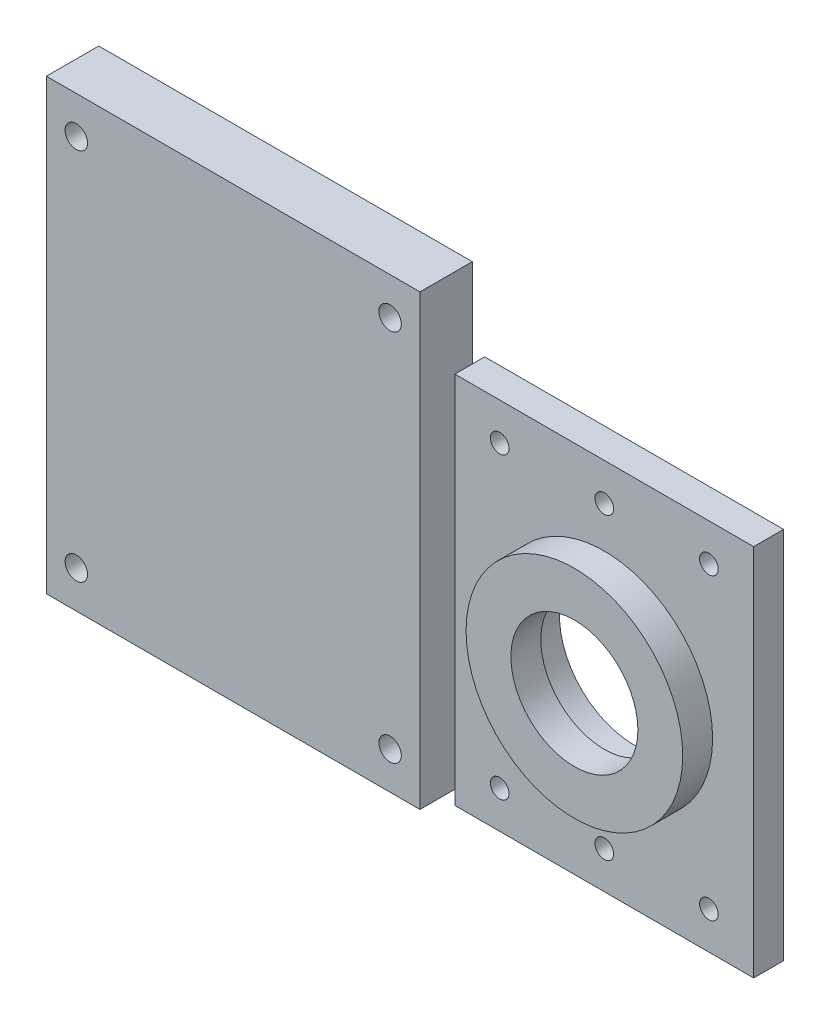
ISO-10303-21;
HEADER;
FILE_DESCRIPTION(('STEP AP214'),'2;1');
FILE_NAME('part.step','',(''),(''),'','','');
FILE_SCHEMA(('AUTOMOTIVE_DESIGN { 1 0 10303 214 1 1 1 1 }'));
ENDSEC;
DATA;
#1=APPLICATION_CONTEXT('core data for automotive mechanical design processes');
#2=APPLICATION_PROTOCOL_DEFINITION('international standard','automotive_design',2000,#1);
#3=PRODUCT_CONTEXT('',#1,'mechanical');
#4=PRODUCT('Part','Part','',(#3));
#5=PRODUCT_RELATED_PRODUCT_CATEGORY('part','',(#4));
#6=PRODUCT_DEFINITION_FORMATION('','',#4);
#7=PRODUCT_DEFINITION_CONTEXT('part definition',#1,'design');
#8=PRODUCT_DEFINITION('design','',#6,#7);
#9=PRODUCT_DEFINITION_SHAPE('','',#8);
#10=(LENGTH_UNIT() NAMED_UNIT(*) SI_UNIT(.MILLI.,.METRE.));
#11=(NAMED_UNIT(*) PLANE_ANGLE_UNIT() SI_UNIT($,.RADIAN.));
#12=(NAMED_UNIT(*) SI_UNIT($,.STERADIAN.) SOLID_ANGLE_UNIT());
#13=UNCERTAINTY_MEASURE_WITH_UNIT(LENGTH_MEASURE(1.E-05),#10,'distance_accuracy_value','');
#14=(GEOMETRIC_REPRESENTATION_CONTEXT(3) GLOBAL_UNCERTAINTY_ASSIGNED_CONTEXT((#13)) GLOBAL_UNIT_ASSIGNED_CONTEXT((#10,
#11,#12)) REPRESENTATION_CONTEXT('',''));
#15=CARTESIAN_POINT('',(0.,0.,0.));
#16=DIRECTION('',(0.,0.,1.));
#17=DIRECTION('',(1.,0.,0.));
#18=AXIS2_PLACEMENT_3D('',#15,#16,#17);
#19=CARTESIAN_POINT('',(-71.6694010067614,-24.8008935751944,7.));
#20=DIRECTION('',(-1.,0.,0.));
#21=DIRECTION('',(0.,-1.,0.));
#22=AXIS2_PLACEMENT_3D('',#19,#20,#21);
#23=PLANE('',#22);
#24=DIRECTION('',(0.,1.,0.));
#25=VECTOR('',#24,1.);
#26=CARTESIAN_POINT('',(-71.6694010067614,-24.8008935751944,0.));
#27=LINE('',#26,#25);
#28=CARTESIAN_POINT('',(-71.6694010067614,-24.8008935751944,0.));
#29=VERTEX_POINT('',#28);
#30=CARTESIAN_POINT('',(-71.6694010067614,35.1991064248056,0.));
#31=VERTEX_POINT('',#30);
#32=EDGE_CURVE('E128',#29,#31,#27,.T.);
#33=ORIENTED_EDGE('',*,*,#32,.F.);
#34=DIRECTION('',(0.,0.,-1.));
#35=VECTOR('',#34,1.);
#36=CARTESIAN_POINT('',(-71.6694010067614,-24.8008935751944,7.));
#37=LINE('',#36,#35);
#38=CARTESIAN_POINT('',(-71.6694010067614,-24.8008935751944,7.));
#39=VERTEX_POINT('',#38);
#40=EDGE_CURVE('E12',#39,#29,#37,.T.);
#41=ORIENTED_EDGE('',*,*,#40,.F.);
#42=DIRECTION('',(0.,1.,0.));
#43=VECTOR('',#42,1.);
#44=CARTESIAN_POINT('',(-71.6694010067614,-24.8008935751944,7.));
#45=LINE('',#44,#43);
#46=CARTESIAN_POINT('',(-71.6694010067614,35.1991064248056,7.));
#47=VERTEX_POINT('',#46);
#48=EDGE_CURVE('E119',#39,#47,#45,.T.);
#49=ORIENTED_EDGE('',*,*,#48,.T.);
#50=DIRECTION('',(0.,0.,-1.));
#51=VECTOR('',#50,1.);
#52=CARTESIAN_POINT('',(-71.6694010067614,35.1991064248056,7.));
#53=LINE('',#52,#51);
#54=EDGE_CURVE('E60',#47,#31,#53,.T.);
#55=ORIENTED_EDGE('',*,*,#54,.T.);
#56=EDGE_LOOP('',(#33,#41,#49,#55));
#57=FACE_BOUND('',#56,.T.);
#58=ADVANCED_FACE('F57',(#57),#23,.T.);
#59=CARTESIAN_POINT('',(-71.6694010067614,-24.8008935751944,7.));
#60=DIRECTION('',(0.,-1.,0.));
#61=DIRECTION('',(0.,0.,-1.));
#62=AXIS2_PLACEMENT_3D('',#59,#60,#61);
#63=PLANE('',#62);
#64=DIRECTION('',(-1.,0.,0.));
#65=VECTOR('',#64,1.);
#66=CARTESIAN_POINT('',(-71.6694010067614,-24.8008935751944,0.));
#67=LINE('',#66,#65);
#68=CARTESIAN_POINT('',(-21.6694010067614,-24.8008935751944,0.));
#69=VERTEX_POINT('',#68);
#70=EDGE_CURVE('E122',#69,#29,#67,.T.);
#71=ORIENTED_EDGE('',*,*,#70,.F.);
#72=DIRECTION('',(0.,0.,-1.));
#73=VECTOR('',#72,1.);
#74=CARTESIAN_POINT('',(-21.6694010067614,-24.8008935751944,7.));
#75=LINE('',#74,#73);
#76=CARTESIAN_POINT('',(-21.6694010067614,-24.8008935751944,7.));
#77=VERTEX_POINT('',#76);
#78=EDGE_CURVE('E67',#77,#69,#75,.T.);
#79=ORIENTED_EDGE('',*,*,#78,.F.);
#80=DIRECTION('',(-1.,0.,0.));
#81=VECTOR('',#80,1.);
#82=CARTESIAN_POINT('',(-71.6694010067614,-24.8008935751944,7.));
#83=LINE('',#82,#81);
#84=EDGE_CURVE('E114',#77,#39,#83,.T.);
#85=ORIENTED_EDGE('',*,*,#84,.T.);
#86=ORIENTED_EDGE('',*,*,#40,.T.);
#87=EDGE_LOOP('',(#71,#79,#85,#86));
#88=FACE_BOUND('',#87,.T.);
#89=ADVANCED_FACE('F145',(#88),#63,.T.);
#90=CARTESIAN_POINT('',(-21.6694010067614,-24.8008935751944,7.));
#91=DIRECTION('',(1.,0.,0.));
#92=DIRECTION('',(0.,0.,-1.));
#93=AXIS2_PLACEMENT_3D('',#90,#91,#92);
#94=PLANE('',#93);
#95=DIRECTION('',(0.,-1.,0.));
#96=VECTOR('',#95,1.);
#97=CARTESIAN_POINT('',(-21.6694010067614,-24.8008935751944,0.));
#98=LINE('',#97,#96);
#99=CARTESIAN_POINT('',(-21.6694010067614,35.1991064248056,0.));
#100=VERTEX_POINT('',#99);
#101=EDGE_CURVE('E108',#100,#69,#98,.T.);
#102=ORIENTED_EDGE('',*,*,#101,.F.);
#103=DIRECTION('',(0.,0.,-1.));
#104=VECTOR('',#103,1.);
#105=CARTESIAN_POINT('',(-21.6694010067614,35.1991064248056,7.));
#106=LINE('',#105,#104);
#107=CARTESIAN_POINT('',(-21.6694010067614,35.1991064248056,7.));
#108=VERTEX_POINT('',#107);
#109=EDGE_CURVE('E103',#108,#100,#106,.T.);
#110=ORIENTED_EDGE('',*,*,#109,.F.);
#111=DIRECTION('',(0.,-1.,0.));
#112=VECTOR('',#111,1.);
#113=CARTESIAN_POINT('',(-21.6694010067614,-24.8008935751944,7.));
#114=LINE('',#113,#112);
#115=EDGE_CURVE('E106',#108,#77,#114,.T.);
#116=ORIENTED_EDGE('',*,*,#115,.T.);
#117=ORIENTED_EDGE('',*,*,#78,.T.);
#118=EDGE_LOOP('',(#102,#110,#116,#117));
#119=FACE_BOUND('',#118,.T.);
#120=ADVANCED_FACE('F105',(#119),#94,.T.);
#121=CARTESIAN_POINT('',(-71.6694010067614,35.1991064248056,7.));
#122=DIRECTION('',(0.,1.,0.));
#123=DIRECTION('',(0.,0.,1.));
#124=AXIS2_PLACEMENT_3D('',#121,#122,#123);
#125=PLANE('',#124);
#126=DIRECTION('',(1.,0.,0.));
#127=VECTOR('',#126,1.);
#128=CARTESIAN_POINT('',(-71.6694010067614,35.1991064248056,0.));
#129=LINE('',#128,#127);
#130=EDGE_CURVE('E132',#31,#100,#129,.T.);
#131=ORIENTED_EDGE('',*,*,#130,.F.);
#132=ORIENTED_EDGE('',*,*,#54,.F.);
#133=DIRECTION('',(1.,0.,0.));
#134=VECTOR('',#133,1.);
#135=CARTESIAN_POINT('',(-71.6694010067614,35.1991064248056,7.));
#136=LINE('',#135,#134);
#137=EDGE_CURVE('E113',#47,#108,#136,.T.);
#138=ORIENTED_EDGE('',*,*,#137,.T.);
#139=ORIENTED_EDGE('',*,*,#109,.T.);
#140=EDGE_LOOP('',(#131,#132,#138,#139));
#141=FACE_BOUND('',#140,.T.);
#142=ADVANCED_FACE('F117',(#141),#125,.T.);
#143=CARTESIAN_POINT('',(0.,0.,7.));
#144=DIRECTION('',(0.,0.,-1.));
#145=DIRECTION('',(-1.,0.,0.));
#146=AXIS2_PLACEMENT_3D('',#143,#144,#145);
#147=PLANE('',#146);
#148=CARTESIAN_POINT('',(-67.6694010067614,30.1991064248056,7.));
#149=DIRECTION('',(0.,0.,-1.));
#150=DIRECTION('',(1.,0.,0.));
#151=AXIS2_PLACEMENT_3D('',#148,#149,#150);
#152=CIRCLE('',#151,1.5);
#153=CARTESIAN_POINT('',(-66.1694010067614,30.1991064248056,7.));
#154=VERTEX_POINT('',#153);
#155=EDGE_CURVE('E186',#154,#154,#152,.T.);
#156=ORIENTED_EDGE('',*,*,#155,.T.);
#157=EDGE_LOOP('',(#156));
#158=FACE_BOUND('',#157,.T.);
#159=CARTESIAN_POINT('',(-25.6694010067614,30.1991064248056,7.));
#160=DIRECTION('',(0.,0.,-1.));
#161=DIRECTION('',(-1.,0.,0.));
#162=AXIS2_PLACEMENT_3D('',#159,#160,#161);
#163=CIRCLE('',#162,1.5);
#164=CARTESIAN_POINT('',(-27.1694010067614,30.1991064248056,7.));
#165=VERTEX_POINT('',#164);
#166=EDGE_CURVE('E196',#165,#165,#163,.T.);
#167=ORIENTED_EDGE('',*,*,#166,.T.);
#168=EDGE_LOOP('',(#167));
#169=FACE_BOUND('',#168,.T.);
#170=CARTESIAN_POINT('',(-25.6694010067614,-19.8008935751944,7.));
#171=DIRECTION('',(0.,0.,-1.));
#172=DIRECTION('',(1.,0.,0.));
#173=AXIS2_PLACEMENT_3D('',#170,#171,#172);
#174=CIRCLE('',#173,1.5);
#175=CARTESIAN_POINT('',(-24.1694010067614,-19.8008935751944,7.));
#176=VERTEX_POINT('',#175);
#177=EDGE_CURVE('E204',#176,#176,#174,.T.);
#178=ORIENTED_EDGE('',*,*,#177,.T.);
#179=EDGE_LOOP('',(#178));
#180=FACE_BOUND('',#179,.T.);
#181=CARTESIAN_POINT('',(-67.6694010067614,-19.8008935751944,7.));
#182=DIRECTION('',(0.,0.,-1.));
#183=DIRECTION('',(-1.,0.,0.));
#184=AXIS2_PLACEMENT_3D('',#181,#182,#183);
#185=CIRCLE('',#184,1.5);
#186=CARTESIAN_POINT('',(-69.1694010067614,-19.8008935751944,7.));
#187=VERTEX_POINT('',#186);
#188=EDGE_CURVE('E133',#187,#187,#185,.T.);
#189=ORIENTED_EDGE('',*,*,#188,.T.);
#190=EDGE_LOOP('',(#189));
#191=FACE_BOUND('',#190,.T.);
#192=ORIENTED_EDGE('',*,*,#48,.F.);
#193=ORIENTED_EDGE('',*,*,#84,.F.);
#194=ORIENTED_EDGE('',*,*,#115,.F.);
#195=ORIENTED_EDGE('',*,*,#137,.F.);
#196=EDGE_LOOP('',(#192,#193,#194,#195));
#197=FACE_BOUND('',#196,.T.);
#198=ADVANCED_FACE('F112',(#158,#169,#180,#191,#197),#147,.F.);
#199=CARTESIAN_POINT('',(0.,0.,0.));
#200=DIRECTION('',(0.,0.,-1.));
#201=DIRECTION('',(-1.,0.,0.));
#202=AXIS2_PLACEMENT_3D('',#199,#200,#201);
#203=PLANE('',#202);
#204=CARTESIAN_POINT('',(-67.6694010067614,30.1991064248056,0.));
#205=DIRECTION('',(0.,0.,-1.));
#206=DIRECTION('',(1.,0.,0.));
#207=AXIS2_PLACEMENT_3D('',#204,#205,#206);
#208=CIRCLE('',#207,1.5);
#209=CARTESIAN_POINT('',(-66.1694010067614,30.1991064248056,0.));
#210=VERTEX_POINT('',#209);
#211=EDGE_CURVE('E189',#210,#210,#208,.T.);
#212=ORIENTED_EDGE('',*,*,#211,.F.);
#213=EDGE_LOOP('',(#212));
#214=FACE_BOUND('',#213,.T.);
#215=CARTESIAN_POINT('',(-25.6694010067614,30.1991064248056,0.));
#216=DIRECTION('',(0.,0.,-1.));
#217=DIRECTION('',(-1.,0.,0.));
#218=AXIS2_PLACEMENT_3D('',#215,#216,#217);
#219=CIRCLE('',#218,1.5);
#220=CARTESIAN_POINT('',(-27.1694010067614,30.1991064248056,0.));
#221=VERTEX_POINT('',#220);
#222=EDGE_CURVE('E193',#221,#221,#219,.T.);
#223=ORIENTED_EDGE('',*,*,#222,.F.);
#224=EDGE_LOOP('',(#223));
#225=FACE_BOUND('',#224,.T.);
#226=CARTESIAN_POINT('',(-25.6694010067614,-19.8008935751944,0.));
#227=DIRECTION('',(0.,0.,-1.));
#228=DIRECTION('',(1.,0.,0.));
#229=AXIS2_PLACEMENT_3D('',#226,#227,#228);
#230=CIRCLE('',#229,1.5);
#231=CARTESIAN_POINT('',(-24.1694010067614,-19.8008935751944,0.));
#232=VERTEX_POINT('',#231);
#233=EDGE_CURVE('E200',#232,#232,#230,.T.);
#234=ORIENTED_EDGE('',*,*,#233,.F.);
#235=EDGE_LOOP('',(#234));
#236=FACE_BOUND('',#235,.T.);
#237=CARTESIAN_POINT('',(-67.6694010067614,-19.8008935751944,0.));
#238=DIRECTION('',(0.,0.,-1.));
#239=DIRECTION('',(-1.,0.,0.));
#240=AXIS2_PLACEMENT_3D('',#237,#238,#239);
#241=CIRCLE('',#240,1.5);
#242=CARTESIAN_POINT('',(-69.1694010067614,-19.8008935751944,0.));
#243=VERTEX_POINT('',#242);
#244=EDGE_CURVE('E208',#243,#243,#241,.T.);
#245=ORIENTED_EDGE('',*,*,#244,.F.);
#246=EDGE_LOOP('',(#245));
#247=FACE_BOUND('',#246,.T.);
#248=ORIENTED_EDGE('',*,*,#32,.T.);
#249=ORIENTED_EDGE('',*,*,#130,.T.);
#250=ORIENTED_EDGE('',*,*,#101,.T.);
#251=ORIENTED_EDGE('',*,*,#70,.T.);
#252=EDGE_LOOP('',(#248,#249,#250,#251));
#253=FACE_BOUND('',#252,.T.);
#254=ADVANCED_FACE('F144',(#214,#225,#236,#247,#253),#203,.T.);
#255=CARTESIAN_POINT('',(-67.6694010067614,-19.8008935751944,7.));
#256=DIRECTION('',(0.,0.,-1.));
#257=DIRECTION('',(-1.,0.,0.));
#258=AXIS2_PLACEMENT_3D('',#255,#256,#257);
#259=CYLINDRICAL_SURFACE('',#258,1.5);
#260=ORIENTED_EDGE('',*,*,#188,.F.);
#261=EDGE_LOOP('',(#260));
#262=FACE_BOUND('',#261,.T.);
#263=ORIENTED_EDGE('',*,*,#244,.T.);
#264=EDGE_LOOP('',(#263));
#265=FACE_BOUND('',#264,.T.);
#266=ADVANCED_FACE('F163',(#262,#265),#259,.F.);
#267=CARTESIAN_POINT('',(-25.6694010067614,-19.8008935751944,7.));
#268=DIRECTION('',(0.,0.,-1.));
#269=DIRECTION('',(-1.,0.,0.));
#270=AXIS2_PLACEMENT_3D('',#267,#268,#269);
#271=CYLINDRICAL_SURFACE('',#270,1.5);
#272=ORIENTED_EDGE('',*,*,#177,.F.);
#273=EDGE_LOOP('',(#272));
#274=FACE_BOUND('',#273,.T.);
#275=ORIENTED_EDGE('',*,*,#233,.T.);
#276=EDGE_LOOP('',(#275));
#277=FACE_BOUND('',#276,.T.);
#278=ADVANCED_FACE('F170',(#274,#277),#271,.F.);
#279=CARTESIAN_POINT('',(-25.6694010067614,30.1991064248056,7.));
#280=DIRECTION('',(0.,0.,-1.));
#281=DIRECTION('',(-1.,0.,0.));
#282=AXIS2_PLACEMENT_3D('',#279,#280,#281);
#283=CYLINDRICAL_SURFACE('',#282,1.5);
#284=ORIENTED_EDGE('',*,*,#166,.F.);
#285=EDGE_LOOP('',(#284));
#286=FACE_BOUND('',#285,.T.);
#287=ORIENTED_EDGE('',*,*,#222,.T.);
#288=EDGE_LOOP('',(#287));
#289=FACE_BOUND('',#288,.T.);
#290=ADVANCED_FACE('F174',(#286,#289),#283,.F.);
#291=CARTESIAN_POINT('',(-67.6694010067614,30.1991064248056,7.));
#292=DIRECTION('',(0.,0.,-1.));
#293=DIRECTION('',(-1.,0.,0.));
#294=AXIS2_PLACEMENT_3D('',#291,#292,#293);
#295=CYLINDRICAL_SURFACE('',#294,1.5);
#296=ORIENTED_EDGE('',*,*,#155,.F.);
#297=EDGE_LOOP('',(#296));
#298=FACE_BOUND('',#297,.T.);
#299=ORIENTED_EDGE('',*,*,#211,.T.);
#300=EDGE_LOOP('',(#299));
#301=FACE_BOUND('',#300,.T.);
#302=ADVANCED_FACE('F178',(#298,#301),#295,.F.);
#303=CLOSED_SHELL('',(#58,#89,#120,#142,#198,#254,#266,#278,#290,#302));
#304=MANIFOLD_SOLID_BREP('B2_NOT_SHOWN',#303);
#305=CARTESIAN_POINT('',(0.,0.,4.));
#306=DIRECTION('',(0.,0.,1.));
#307=DIRECTION('',(1.,0.,0.));
#308=AXIS2_PLACEMENT_3D('',#305,#306,#307);
#309=PLANE('',#308);
#310=CARTESIAN_POINT('',(0.,0.,4.));
#311=DIRECTION('',(0.,0.,1.));
#312=DIRECTION('',(1.,0.,0.));
#313=AXIS2_PLACEMENT_3D('',#310,#311,#312);
#314=CIRCLE('',#313,14.5);
#315=CARTESIAN_POINT('',(14.5,0.,4.));
#316=VERTEX_POINT('',#315);
#317=EDGE_CURVE('E406',#316,#316,#314,.T.);
#318=ORIENTED_EDGE('',*,*,#317,.F.);
#319=EDGE_LOOP('',(#318));
#320=FACE_BOUND('',#319,.T.);
#321=CARTESIAN_POINT('',(0.,-20.,4.));
#322=DIRECTION('',(0.,0.,1.));
#323=DIRECTION('',(1.,0.,0.));
#324=AXIS2_PLACEMENT_3D('',#321,#322,#323);
#325=CIRCLE('',#324,1.25);
#326=CARTESIAN_POINT('',(1.25,-20.,4.));
#327=VERTEX_POINT('',#326);
#328=EDGE_CURVE('E388',#327,#327,#325,.T.);
#329=ORIENTED_EDGE('',*,*,#328,.F.);
#330=EDGE_LOOP('',(#329));
#331=FACE_BOUND('',#330,.T.);
#332=CARTESIAN_POINT('',(-14.,20.,4.));
#333=DIRECTION('',(0.,0.,1.));
#334=DIRECTION('',(1.,0.,0.));
#335=AXIS2_PLACEMENT_3D('',#332,#333,#334);
#336=CIRCLE('',#335,1.25);
#337=CARTESIAN_POINT('',(-12.75,20.,4.));
#338=VERTEX_POINT('',#337);
#339=EDGE_CURVE('E376',#338,#338,#336,.T.);
#340=ORIENTED_EDGE('',*,*,#339,.F.);
#341=EDGE_LOOP('',(#340));
#342=FACE_BOUND('',#341,.T.);
#343=CARTESIAN_POINT('',(-14.,-20.,4.));
#344=DIRECTION('',(0.,0.,1.));
#345=DIRECTION('',(1.,0.,0.));
#346=AXIS2_PLACEMENT_3D('',#343,#344,#345);
#347=CIRCLE('',#346,1.25);
#348=CARTESIAN_POINT('',(-12.75,-20.,4.));
#349=VERTEX_POINT('',#348);
#350=EDGE_CURVE('E366',#349,#349,#347,.T.);
#351=ORIENTED_EDGE('',*,*,#350,.F.);
#352=EDGE_LOOP('',(#351));
#353=FACE_BOUND('',#352,.T.);
#354=DIRECTION('',(1.,0.,0.));
#355=VECTOR('',#354,1.);
#356=CARTESIAN_POINT('',(-20.,-25.,4.));
#357=LINE('',#356,#355);
#358=CARTESIAN_POINT('',(-20.,-25.,4.));
#359=VERTEX_POINT('',#358);
#360=CARTESIAN_POINT('',(20.,-25.,4.));
#361=VERTEX_POINT('',#360);
#362=EDGE_CURVE('E337',#359,#361,#357,.T.);
#363=ORIENTED_EDGE('',*,*,#362,.T.);
#364=DIRECTION('',(0.,1.,0.));
#365=VECTOR('',#364,1.);
#366=CARTESIAN_POINT('',(20.,-25.,4.));
#367=LINE('',#366,#365);
#368=CARTESIAN_POINT('',(20.,25.,4.));
#369=VERTEX_POINT('',#368);
#370=EDGE_CURVE('E332',#361,#369,#367,.T.);
#371=ORIENTED_EDGE('',*,*,#370,.T.);
#372=DIRECTION('',(-1.,0.,0.));
#373=VECTOR('',#372,1.);
#374=CARTESIAN_POINT('',(-20.,25.,4.));
#375=LINE('',#374,#373);
#376=CARTESIAN_POINT('',(-20.,25.,4.));
#377=VERTEX_POINT('',#376);
#378=EDGE_CURVE('E335',#369,#377,#375,.T.);
#379=ORIENTED_EDGE('',*,*,#378,.T.);
#380=DIRECTION('',(0.,-1.,0.));
#381=VECTOR('',#380,1.);
#382=CARTESIAN_POINT('',(-20.,-25.,4.));
#383=LINE('',#382,#381);
#384=EDGE_CURVE('E302',#377,#359,#383,.T.);
#385=ORIENTED_EDGE('',*,*,#384,.T.);
#386=EDGE_LOOP('',(#363,#371,#379,#385));
#387=FACE_BOUND('',#386,.T.);
#388=CARTESIAN_POINT('',(14.,-20.,4.));
#389=DIRECTION('',(0.,0.,1.));
#390=DIRECTION('',(1.,0.,0.));
#391=AXIS2_PLACEMENT_3D('',#388,#389,#390);
#392=CIRCLE('',#391,1.25);
#393=CARTESIAN_POINT('',(15.25,-20.,4.));
#394=VERTEX_POINT('',#393);
#395=EDGE_CURVE('E370',#394,#394,#392,.T.);
#396=ORIENTED_EDGE('',*,*,#395,.F.);
#397=EDGE_LOOP('',(#396));
#398=FACE_BOUND('',#397,.T.);
#399=CARTESIAN_POINT('',(14.,20.,4.));
#400=DIRECTION('',(0.,0.,1.));
#401=DIRECTION('',(1.,0.,0.));
#402=AXIS2_PLACEMENT_3D('',#399,#400,#401);
#403=CIRCLE('',#402,1.25);
#404=CARTESIAN_POINT('',(15.25,20.,4.));
#405=VERTEX_POINT('',#404);
#406=EDGE_CURVE('E382',#405,#405,#403,.T.);
#407=ORIENTED_EDGE('',*,*,#406,.F.);
#408=EDGE_LOOP('',(#407));
#409=FACE_BOUND('',#408,.T.);
#410=CARTESIAN_POINT('',(0.,20.,4.));
#411=DIRECTION('',(0.,0.,1.));
#412=DIRECTION('',(1.,0.,0.));
#413=AXIS2_PLACEMENT_3D('',#410,#411,#412);
#414=CIRCLE('',#413,1.25);
#415=CARTESIAN_POINT('',(1.25,20.,4.));
#416=VERTEX_POINT('',#415);
#417=EDGE_CURVE('E394',#416,#416,#414,.T.);
#418=ORIENTED_EDGE('',*,*,#417,.F.);
#419=EDGE_LOOP('',(#418));
#420=FACE_BOUND('',#419,.T.);
#421=ADVANCED_FACE('F285',(#320,#331,#342,#353,#387,#398,#409,#420),#309,.T.);
#422=CARTESIAN_POINT('',(0.,0.,0.));
#423=DIRECTION('',(0.,0.,1.));
#424=DIRECTION('',(1.,0.,0.));
#425=AXIS2_PLACEMENT_3D('',#422,#423,#424);
#426=PLANE('',#425);
#427=DIRECTION('',(1.,0.,0.));
#428=VECTOR('',#427,1.);
#429=CARTESIAN_POINT('',(-20.,-25.,0.));
#430=LINE('',#429,#428);
#431=CARTESIAN_POINT('',(-20.,-25.,0.));
#432=VERTEX_POINT('',#431);
#433=CARTESIAN_POINT('',(20.,-25.,0.));
#434=VERTEX_POINT('',#433);
#435=EDGE_CURVE('E349',#432,#434,#430,.T.);
#436=ORIENTED_EDGE('',*,*,#435,.F.);
#437=DIRECTION('',(0.,-1.,0.));
#438=VECTOR('',#437,1.);
#439=CARTESIAN_POINT('',(-20.,-25.,0.));
#440=LINE('',#439,#438);
#441=CARTESIAN_POINT('',(-20.,25.,0.));
#442=VERTEX_POINT('',#441);
#443=EDGE_CURVE('E325',#442,#432,#440,.T.);
#444=ORIENTED_EDGE('',*,*,#443,.F.);
#445=DIRECTION('',(-1.,0.,0.));
#446=VECTOR('',#445,1.);
#447=CARTESIAN_POINT('',(-20.,25.,0.));
#448=LINE('',#447,#446);
#449=CARTESIAN_POINT('',(20.,25.,0.));
#450=VERTEX_POINT('',#449);
#451=EDGE_CURVE('E319',#450,#442,#448,.T.);
#452=ORIENTED_EDGE('',*,*,#451,.F.);
#453=DIRECTION('',(0.,1.,0.));
#454=VECTOR('',#453,1.);
#455=CARTESIAN_POINT('',(20.,-25.,0.));
#456=LINE('',#455,#454);
#457=EDGE_CURVE('E341',#434,#450,#456,.T.);
#458=ORIENTED_EDGE('',*,*,#457,.F.);
#459=EDGE_LOOP('',(#436,#444,#452,#458));
#460=FACE_BOUND('',#459,.T.);
#461=CARTESIAN_POINT('',(0.,0.,0.));
#462=DIRECTION('',(0.,0.,1.));
#463=DIRECTION('',(1.,0.,0.));
#464=AXIS2_PLACEMENT_3D('',#461,#462,#463);
#465=CIRCLE('',#464,10.);
#466=CARTESIAN_POINT('',(10.,0.,0.));
#467=VERTEX_POINT('',#466);
#468=EDGE_CURVE('E352',#467,#467,#465,.T.);
#469=ORIENTED_EDGE('',*,*,#468,.T.);
#470=EDGE_LOOP('',(#469));
#471=FACE_BOUND('',#470,.T.);
#472=CARTESIAN_POINT('',(-14.,-20.,0.));
#473=DIRECTION('',(0.,0.,1.));
#474=DIRECTION('',(1.,0.,0.));
#475=AXIS2_PLACEMENT_3D('',#472,#473,#474);
#476=CIRCLE('',#475,1.25);
#477=CARTESIAN_POINT('',(-12.75,-20.,0.));
#478=VERTEX_POINT('',#477);
#479=EDGE_CURVE('E367',#478,#478,#476,.T.);
#480=ORIENTED_EDGE('',*,*,#479,.T.);
#481=EDGE_LOOP('',(#480));
#482=FACE_BOUND('',#481,.T.);
#483=CARTESIAN_POINT('',(14.,-20.,0.));
#484=DIRECTION('',(0.,0.,1.));
#485=DIRECTION('',(1.,0.,0.));
#486=AXIS2_PLACEMENT_3D('',#483,#484,#485);
#487=CIRCLE('',#486,1.25);
#488=CARTESIAN_POINT('',(15.25,-20.,0.));
#489=VERTEX_POINT('',#488);
#490=EDGE_CURVE('E373',#489,#489,#487,.T.);
#491=ORIENTED_EDGE('',*,*,#490,.T.);
#492=EDGE_LOOP('',(#491));
#493=FACE_BOUND('',#492,.T.);
#494=CARTESIAN_POINT('',(-14.,20.,0.));
#495=DIRECTION('',(0.,0.,1.));
#496=DIRECTION('',(1.,0.,0.));
#497=AXIS2_PLACEMENT_3D('',#494,#495,#496);
#498=CIRCLE('',#497,1.25);
#499=CARTESIAN_POINT('',(-12.75,20.,0.));
#500=VERTEX_POINT('',#499);
#501=EDGE_CURVE('E379',#500,#500,#498,.T.);
#502=ORIENTED_EDGE('',*,*,#501,.T.);
#503=EDGE_LOOP('',(#502));
#504=FACE_BOUND('',#503,.T.);
#505=CARTESIAN_POINT('',(14.,20.,0.));
#506=DIRECTION('',(0.,0.,1.));
#507=DIRECTION('',(1.,0.,0.));
#508=AXIS2_PLACEMENT_3D('',#505,#506,#507);
#509=CIRCLE('',#508,1.25);
#510=CARTESIAN_POINT('',(15.25,20.,0.));
#511=VERTEX_POINT('',#510);
#512=EDGE_CURVE('E385',#511,#511,#509,.T.);
#513=ORIENTED_EDGE('',*,*,#512,.T.);
#514=EDGE_LOOP('',(#513));
#515=FACE_BOUND('',#514,.T.);
#516=CARTESIAN_POINT('',(0.,-20.,0.));
#517=DIRECTION('',(0.,0.,1.));
#518=DIRECTION('',(1.,0.,0.));
#519=AXIS2_PLACEMENT_3D('',#516,#517,#518);
#520=CIRCLE('',#519,1.25);
#521=CARTESIAN_POINT('',(1.25,-20.,0.));
#522=VERTEX_POINT('',#521);
#523=EDGE_CURVE('E391',#522,#522,#520,.T.);
#524=ORIENTED_EDGE('',*,*,#523,.T.);
#525=EDGE_LOOP('',(#524));
#526=FACE_BOUND('',#525,.T.);
#527=CARTESIAN_POINT('',(0.,20.,0.));
#528=DIRECTION('',(0.,0.,1.));
#529=DIRECTION('',(1.,0.,0.));
#530=AXIS2_PLACEMENT_3D('',#527,#528,#529);
#531=CIRCLE('',#530,1.25);
#532=CARTESIAN_POINT('',(1.25,20.,0.));
#533=VERTEX_POINT('',#532);
#534=EDGE_CURVE('E397',#533,#533,#531,.T.);
#535=ORIENTED_EDGE('',*,*,#534,.T.);
#536=EDGE_LOOP('',(#535));
#537=FACE_BOUND('',#536,.T.);
#538=ADVANCED_FACE('F360',(#460,#471,#482,#493,#504,#515,#526,#537),#426,.F.);
#539=CARTESIAN_POINT('',(-20.,-25.,4.));
#540=DIRECTION('',(0.,1.,0.));
#541=DIRECTION('',(-1.,0.,0.));
#542=AXIS2_PLACEMENT_3D('',#539,#540,#541);
#543=PLANE('',#542);
#544=ORIENTED_EDGE('',*,*,#435,.T.);
#545=DIRECTION('',(0.,0.,-1.));
#546=VECTOR('',#545,1.);
#547=CARTESIAN_POINT('',(20.,-25.,4.));
#548=LINE('',#547,#546);
#549=EDGE_CURVE('E55',#361,#434,#548,.T.);
#550=ORIENTED_EDGE('',*,*,#549,.F.);
#551=ORIENTED_EDGE('',*,*,#362,.F.);
#552=DIRECTION('',(0.,0.,-1.));
#553=VECTOR('',#552,1.);
#554=CARTESIAN_POINT('',(-20.,-25.,4.));
#555=LINE('',#554,#553);
#556=EDGE_CURVE('E345',#359,#432,#555,.T.);
#557=ORIENTED_EDGE('',*,*,#556,.T.);
#558=EDGE_LOOP('',(#544,#550,#551,#557));
#559=FACE_BOUND('',#558,.T.);
#560=ADVANCED_FACE('F287',(#559),#543,.F.);
#561=CARTESIAN_POINT('',(20.,-25.,4.));
#562=DIRECTION('',(-1.,0.,0.));
#563=DIRECTION('',(0.,0.,1.));
#564=AXIS2_PLACEMENT_3D('',#561,#562,#563);
#565=PLANE('',#564);
#566=ORIENTED_EDGE('',*,*,#457,.T.);
#567=DIRECTION('',(0.,0.,-1.));
#568=VECTOR('',#567,1.);
#569=CARTESIAN_POINT('',(20.,25.,4.));
#570=LINE('',#569,#568);
#571=EDGE_CURVE('E294',#369,#450,#570,.T.);
#572=ORIENTED_EDGE('',*,*,#571,.F.);
#573=ORIENTED_EDGE('',*,*,#370,.F.);
#574=ORIENTED_EDGE('',*,*,#549,.T.);
#575=EDGE_LOOP('',(#566,#572,#573,#574));
#576=FACE_BOUND('',#575,.T.);
#577=ADVANCED_FACE('F340',(#576),#565,.F.);
#578=CARTESIAN_POINT('',(-20.,25.,4.));
#579=DIRECTION('',(0.,-1.,0.));
#580=DIRECTION('',(1.,0.,0.));
#581=AXIS2_PLACEMENT_3D('',#578,#579,#580);
#582=PLANE('',#581);
#583=ORIENTED_EDGE('',*,*,#451,.T.);
#584=DIRECTION('',(0.,0.,-1.));
#585=VECTOR('',#584,1.);
#586=CARTESIAN_POINT('',(-20.,25.,4.));
#587=LINE('',#586,#585);
#588=EDGE_CURVE('E342',#377,#442,#587,.T.);
#589=ORIENTED_EDGE('',*,*,#588,.F.);
#590=ORIENTED_EDGE('',*,*,#378,.F.);
#591=ORIENTED_EDGE('',*,*,#571,.T.);
#592=EDGE_LOOP('',(#583,#589,#590,#591));
#593=FACE_BOUND('',#592,.T.);
#594=ADVANCED_FACE('F343',(#593),#582,.F.);
#595=CARTESIAN_POINT('',(-20.,-25.,4.));
#596=DIRECTION('',(1.,0.,0.));
#597=DIRECTION('',(0.,0.,-1.));
#598=AXIS2_PLACEMENT_3D('',#595,#596,#597);
#599=PLANE('',#598);
#600=ORIENTED_EDGE('',*,*,#443,.T.);
#601=ORIENTED_EDGE('',*,*,#556,.F.);
#602=ORIENTED_EDGE('',*,*,#384,.F.);
#603=ORIENTED_EDGE('',*,*,#588,.T.);
#604=EDGE_LOOP('',(#600,#601,#602,#603));
#605=FACE_BOUND('',#604,.T.);
#606=ADVANCED_FACE('F357',(#605),#599,.F.);
#607=CARTESIAN_POINT('',(0.,0.,4.));
#608=DIRECTION('',(0.,0.,-1.));
#609=DIRECTION('',(-1.,0.,0.));
#610=AXIS2_PLACEMENT_3D('',#607,#608,#609);
#611=CYLINDRICAL_SURFACE('',#610,10.);
#612=CARTESIAN_POINT('',(0.,0.,4.));
#613=DIRECTION('',(0.,0.,1.));
#614=DIRECTION('',(1.,0.,0.));
#615=AXIS2_PLACEMENT_3D('',#612,#613,#614);
#616=CIRCLE('',#615,10.);
#617=CARTESIAN_POINT('',(10.,0.,4.));
#618=VERTEX_POINT('',#617);
#619=EDGE_CURVE('E400',#618,#618,#616,.T.);
#620=ORIENTED_EDGE('',*,*,#619,.T.);
#621=EDGE_LOOP('',(#620));
#622=FACE_BOUND('',#621,.T.);
#623=ORIENTED_EDGE('',*,*,#468,.F.);
#624=EDGE_LOOP('',(#623));
#625=FACE_BOUND('',#624,.T.);
#626=ADVANCED_FACE('F448',(#622,#625),#611,.F.);
#627=CARTESIAN_POINT('',(-14.,-20.,4.));
#628=DIRECTION('',(0.,0.,-1.));
#629=DIRECTION('',(-1.,0.,0.));
#630=AXIS2_PLACEMENT_3D('',#627,#628,#629);
#631=CYLINDRICAL_SURFACE('',#630,1.25);
#632=ORIENTED_EDGE('',*,*,#350,.T.);
#633=EDGE_LOOP('',(#632));
#634=FACE_BOUND('',#633,.T.);
#635=ORIENTED_EDGE('',*,*,#479,.F.);
#636=EDGE_LOOP('',(#635));
#637=FACE_BOUND('',#636,.T.);
#638=ADVANCED_FACE('F493',(#634,#637),#631,.F.);
#639=CARTESIAN_POINT('',(14.,-20.,4.));
#640=DIRECTION('',(0.,0.,-1.));
#641=DIRECTION('',(-1.,0.,0.));
#642=AXIS2_PLACEMENT_3D('',#639,#640,#641);
#643=CYLINDRICAL_SURFACE('',#642,1.25);
#644=ORIENTED_EDGE('',*,*,#395,.T.);
#645=EDGE_LOOP('',(#644));
#646=FACE_BOUND('',#645,.T.);
#647=ORIENTED_EDGE('',*,*,#490,.F.);
#648=EDGE_LOOP('',(#647));
#649=FACE_BOUND('',#648,.T.);
#650=ADVANCED_FACE('F501',(#646,#649),#643,.F.);
#651=CARTESIAN_POINT('',(-14.,20.,4.));
#652=DIRECTION('',(0.,0.,-1.));
#653=DIRECTION('',(-1.,0.,0.));
#654=AXIS2_PLACEMENT_3D('',#651,#652,#653);
#655=CYLINDRICAL_SURFACE('',#654,1.25);
#656=ORIENTED_EDGE('',*,*,#339,.T.);
#657=EDGE_LOOP('',(#656));
#658=FACE_BOUND('',#657,.T.);
#659=ORIENTED_EDGE('',*,*,#501,.F.);
#660=EDGE_LOOP('',(#659));
#661=FACE_BOUND('',#660,.T.);
#662=ADVANCED_FACE('F509',(#658,#661),#655,.F.);
#663=CARTESIAN_POINT('',(14.,20.,4.));
#664=DIRECTION('',(0.,0.,-1.));
#665=DIRECTION('',(-1.,0.,0.));
#666=AXIS2_PLACEMENT_3D('',#663,#664,#665);
#667=CYLINDRICAL_SURFACE('',#666,1.25);
#668=ORIENTED_EDGE('',*,*,#406,.T.);
#669=EDGE_LOOP('',(#668));
#670=FACE_BOUND('',#669,.T.);
#671=ORIENTED_EDGE('',*,*,#512,.F.);
#672=EDGE_LOOP('',(#671));
#673=FACE_BOUND('',#672,.T.);
#674=ADVANCED_FACE('F518',(#670,#673),#667,.F.);
#675=CARTESIAN_POINT('',(0.,-20.,4.));
#676=DIRECTION('',(0.,0.,-1.));
#677=DIRECTION('',(-1.,0.,0.));
#678=AXIS2_PLACEMENT_3D('',#675,#676,#677);
#679=CYLINDRICAL_SURFACE('',#678,1.25);
#680=ORIENTED_EDGE('',*,*,#328,.T.);
#681=EDGE_LOOP('',(#680));
#682=FACE_BOUND('',#681,.T.);
#683=ORIENTED_EDGE('',*,*,#523,.F.);
#684=EDGE_LOOP('',(#683));
#685=FACE_BOUND('',#684,.T.);
#686=ADVANCED_FACE('F527',(#682,#685),#679,.F.);
#687=CARTESIAN_POINT('',(0.,20.,4.));
#688=DIRECTION('',(0.,0.,-1.));
#689=DIRECTION('',(-1.,0.,0.));
#690=AXIS2_PLACEMENT_3D('',#687,#688,#689);
#691=CYLINDRICAL_SURFACE('',#690,1.25);
#692=ORIENTED_EDGE('',*,*,#417,.T.);
#693=EDGE_LOOP('',(#692));
#694=FACE_BOUND('',#693,.T.);
#695=ORIENTED_EDGE('',*,*,#534,.F.);
#696=EDGE_LOOP('',(#695));
#697=FACE_BOUND('',#696,.T.);
#698=ADVANCED_FACE('F433',(#694,#697),#691,.F.);
#699=CARTESIAN_POINT('',(0.,0.,4.));
#700=DIRECTION('',(0.,0.,1.));
#701=DIRECTION('',(1.,0.,0.));
#702=AXIS2_PLACEMENT_3D('',#699,#700,#701);
#703=PLANE('',#702);
#704=CARTESIAN_POINT('',(0.,0.,4.));
#705=DIRECTION('',(0.,0.,1.));
#706=DIRECTION('',(1.,0.,0.));
#707=AXIS2_PLACEMENT_3D('',#704,#705,#706);
#708=CIRCLE('',#707,8.5);
#709=CARTESIAN_POINT('',(8.5,0.,4.));
#710=VERTEX_POINT('',#709);
#711=EDGE_CURVE('E412',#710,#710,#708,.T.);
#712=ORIENTED_EDGE('',*,*,#711,.T.);
#713=EDGE_LOOP('',(#712));
#714=FACE_BOUND('',#713,.T.);
#715=ORIENTED_EDGE('',*,*,#619,.F.);
#716=EDGE_LOOP('',(#715));
#717=FACE_BOUND('',#716,.T.);
#718=ADVANCED_FACE('F424',(#714,#717),#703,.F.);
#719=CARTESIAN_POINT('',(0.,0.,8.));
#720=DIRECTION('',(0.,0.,1.));
#721=DIRECTION('',(1.,0.,0.));
#722=AXIS2_PLACEMENT_3D('',#719,#720,#721);
#723=PLANE('',#722);
#724=CARTESIAN_POINT('',(0.,0.,8.));
#725=DIRECTION('',(0.,0.,1.));
#726=DIRECTION('',(1.,0.,0.));
#727=AXIS2_PLACEMENT_3D('',#724,#725,#726);
#728=CIRCLE('',#727,14.5);
#729=CARTESIAN_POINT('',(14.5,0.,8.));
#730=VERTEX_POINT('',#729);
#731=EDGE_CURVE('E405',#730,#730,#728,.T.);
#732=ORIENTED_EDGE('',*,*,#731,.T.);
#733=EDGE_LOOP('',(#732));
#734=FACE_BOUND('',#733,.T.);
#735=CARTESIAN_POINT('',(0.,0.,8.));
#736=DIRECTION('',(0.,0.,1.));
#737=DIRECTION('',(1.,0.,0.));
#738=AXIS2_PLACEMENT_3D('',#735,#736,#737);
#739=CIRCLE('',#738,8.5);
#740=CARTESIAN_POINT('',(8.5,0.,8.));
#741=VERTEX_POINT('',#740);
#742=EDGE_CURVE('E409',#741,#741,#739,.T.);
#743=ORIENTED_EDGE('',*,*,#742,.F.);
#744=EDGE_LOOP('',(#743));
#745=FACE_BOUND('',#744,.T.);
#746=ADVANCED_FACE('F421',(#734,#745),#723,.T.);
#747=CARTESIAN_POINT('',(0.,0.,8.));
#748=DIRECTION('',(0.,0.,-1.));
#749=DIRECTION('',(-1.,0.,0.));
#750=AXIS2_PLACEMENT_3D('',#747,#748,#749);
#751=CYLINDRICAL_SURFACE('',#750,14.5);
#752=ORIENTED_EDGE('',*,*,#731,.F.);
#753=EDGE_LOOP('',(#752));
#754=FACE_BOUND('',#753,.T.);
#755=ORIENTED_EDGE('',*,*,#317,.T.);
#756=EDGE_LOOP('',(#755));
#757=FACE_BOUND('',#756,.T.);
#758=ADVANCED_FACE('F423',(#754,#757),#751,.T.);
#759=CARTESIAN_POINT('',(0.,0.,8.));
#760=DIRECTION('',(0.,0.,-1.));
#761=DIRECTION('',(-1.,0.,0.));
#762=AXIS2_PLACEMENT_3D('',#759,#760,#761);
#763=CYLINDRICAL_SURFACE('',#762,8.5);
#764=ORIENTED_EDGE('',*,*,#742,.T.);
#765=EDGE_LOOP('',(#764));
#766=FACE_BOUND('',#765,.T.);
#767=ORIENTED_EDGE('',*,*,#711,.F.);
#768=EDGE_LOOP('',(#767));
#769=FACE_BOUND('',#768,.T.);
#770=ADVANCED_FACE('F418',(#766,#769),#763,.F.);
#771=CLOSED_SHELL('',(#421,#538,#560,#577,#594,#606,#626,#638,#650,#662,#674,#686,#698,#718,
#746,#758,#770));
#772=MANIFOLD_SOLID_BREP('B6',#771);
#773=ADVANCED_BREP_SHAPE_REPRESENTATION('',(#18,#304,#772),#14);
#774=SHAPE_DEFINITION_REPRESENTATION(#9,#773);
ENDSEC;
END-ISO-10303-21;
